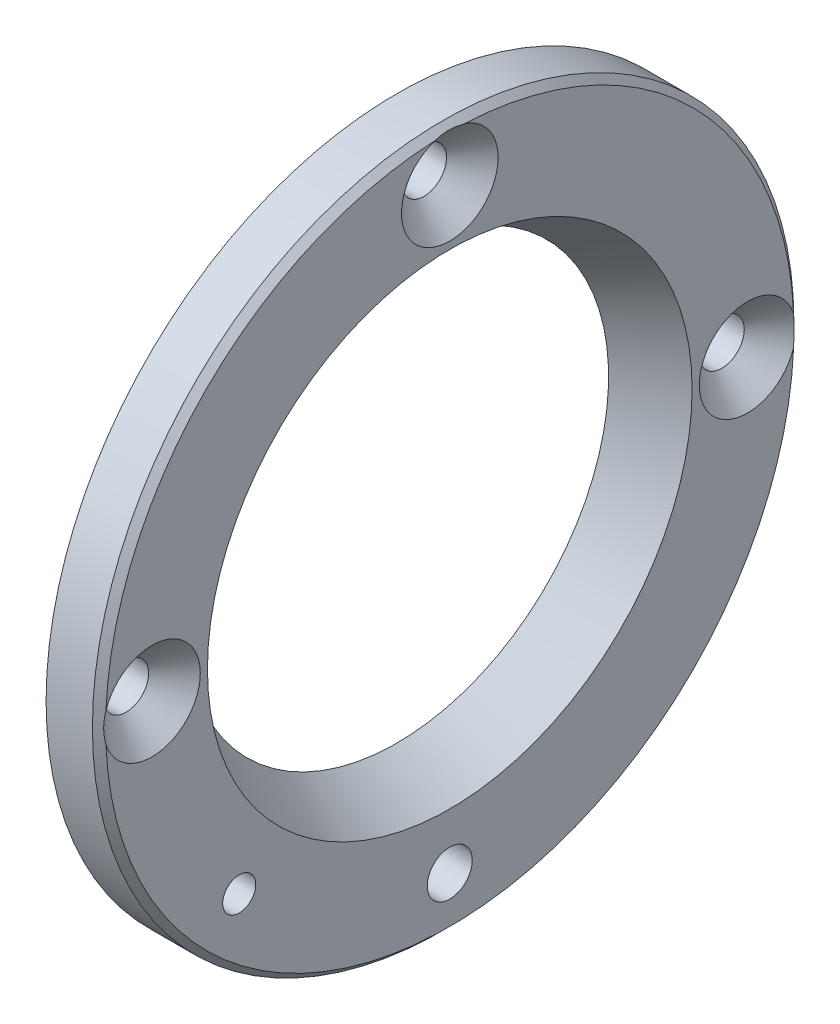
ISO-10303-21;
HEADER;
FILE_DESCRIPTION(('STEP AP214'),'2;1');
FILE_NAME('part.step','',(''),(''),'','','');
FILE_SCHEMA(('AUTOMOTIVE_DESIGN { 1 0 10303 214 1 1 1 1 }'));
ENDSEC;
DATA;
#1=APPLICATION_CONTEXT('core data for automotive mechanical design processes');
#2=APPLICATION_PROTOCOL_DEFINITION('international standard','automotive_design',2000,#1);
#3=PRODUCT_CONTEXT('',#1,'mechanical');
#4=PRODUCT('Part','Part','',(#3));
#5=PRODUCT_RELATED_PRODUCT_CATEGORY('part','',(#4));
#6=PRODUCT_DEFINITION_FORMATION('','',#4);
#7=PRODUCT_DEFINITION_CONTEXT('part definition',#1,'design');
#8=PRODUCT_DEFINITION('design','',#6,#7);
#9=PRODUCT_DEFINITION_SHAPE('','',#8);
#10=(LENGTH_UNIT() NAMED_UNIT(*) SI_UNIT(.MILLI.,.METRE.));
#11=(NAMED_UNIT(*) PLANE_ANGLE_UNIT() SI_UNIT($,.RADIAN.));
#12=(NAMED_UNIT(*) SI_UNIT($,.STERADIAN.) SOLID_ANGLE_UNIT());
#13=UNCERTAINTY_MEASURE_WITH_UNIT(LENGTH_MEASURE(1.E-05),#10,'distance_accuracy_value','');
#14=(GEOMETRIC_REPRESENTATION_CONTEXT(3) GLOBAL_UNCERTAINTY_ASSIGNED_CONTEXT((#13)) GLOBAL_UNIT_ASSIGNED_CONTEXT((#10,
#11,#12)) REPRESENTATION_CONTEXT('',''));
#15=CARTESIAN_POINT('',(0.,0.,0.));
#16=DIRECTION('',(0.,0.,1.));
#17=DIRECTION('',(1.,0.,0.));
#18=AXIS2_PLACEMENT_3D('',#15,#16,#17);
#19=CARTESIAN_POINT('',(4.,26.5,0.));
#20=DIRECTION('',(-1.,0.,0.));
#21=DIRECTION('',(0.,0.,1.));
#22=AXIS2_PLACEMENT_3D('',#19,#20,#21);
#23=PLANE('',#22);
#24=CARTESIAN_POINT('',(4.,0.,0.));
#25=DIRECTION('',(-1.,0.,0.));
#26=DIRECTION('',(0.,0.,1.));
#27=AXIS2_PLACEMENT_3D('',#24,#25,#26);
#28=CIRCLE('',#27,18.3094010767585);
#29=CARTESIAN_POINT('',(4.,0.,18.3094010767585));
#30=VERTEX_POINT('',#29);
#31=EDGE_CURVE('E136',#30,#30,#28,.T.);
#32=ORIENTED_EDGE('',*,*,#31,.T.);
#33=EDGE_LOOP('',(#32));
#34=FACE_BOUND('',#33,.T.);
#35=CARTESIAN_POINT('',(4.,-22.5,0.));
#36=DIRECTION('',(1.,0.,0.));
#37=DIRECTION('',(0.,0.,-1.));
#38=AXIS2_PLACEMENT_3D('',#35,#36,#37);
#39=CIRCLE('',#38,1.7);
#40=CARTESIAN_POINT('',(4.,-22.5,-1.70000000000001));
#41=VERTEX_POINT('',#40);
#42=EDGE_CURVE('E147',#41,#41,#39,.T.);
#43=ORIENTED_EDGE('',*,*,#42,.F.);
#44=EDGE_LOOP('',(#43));
#45=FACE_BOUND('',#44,.T.);
#46=CARTESIAN_POINT('',(4.,0.,22.5));
#47=DIRECTION('',(1.,0.,0.));
#48=DIRECTION('',(0.,0.,-1.));
#49=AXIS2_PLACEMENT_3D('',#46,#47,#48);
#50=CIRCLE('',#49,3.65);
#51=CARTESIAN_POINT('',(4.,-1.11299834032024,25.9761666666667));
#52=VERTEX_POINT('',#51);
#53=CARTESIAN_POINT('',(4.,1.11299834032022,25.9761666666667));
#54=VERTEX_POINT('',#53);
#55=EDGE_CURVE('E160',#52,#54,#50,.T.);
#56=ORIENTED_EDGE('',*,*,#55,.F.);
#57=CARTESIAN_POINT('',(4.,0.,0.));
#58=DIRECTION('',(-1.,0.,0.));
#59=DIRECTION('',(0.,0.,1.));
#60=AXIS2_PLACEMENT_3D('',#57,#58,#59);
#61=CIRCLE('',#60,26.);
#62=CARTESIAN_POINT('',(4.,-1.11299834032023,-25.9761666666667));
#63=VERTEX_POINT('',#62);
#64=EDGE_CURVE('E78',#52,#63,#61,.F.);
#65=ORIENTED_EDGE('',*,*,#64,.T.);
#66=CARTESIAN_POINT('',(4.,0.,-22.5));
#67=DIRECTION('',(1.,0.,0.));
#68=DIRECTION('',(0.,0.,-1.));
#69=AXIS2_PLACEMENT_3D('',#66,#67,#68);
#70=CIRCLE('',#69,3.65);
#71=CARTESIAN_POINT('',(4.,1.11299834032024,-25.9761666666667));
#72=VERTEX_POINT('',#71);
#73=EDGE_CURVE('E74',#72,#63,#70,.T.);
#74=ORIENTED_EDGE('',*,*,#73,.F.);
#75=CARTESIAN_POINT('',(4.,0.,0.));
#76=DIRECTION('',(-1.,0.,0.));
#77=DIRECTION('',(0.,0.,1.));
#78=AXIS2_PLACEMENT_3D('',#75,#76,#77);
#79=CIRCLE('',#78,26.);
#80=CARTESIAN_POINT('',(4.,25.9761666666673,-1.1129983403181));
#81=VERTEX_POINT('',#80);
#82=EDGE_CURVE('E59',#72,#81,#79,.F.);
#83=ORIENTED_EDGE('',*,*,#82,.T.);
#84=CARTESIAN_POINT('',(4.,22.5,0.));
#85=DIRECTION('',(1.,0.,0.));
#86=DIRECTION('',(0.,0.,-1.));
#87=AXIS2_PLACEMENT_3D('',#84,#85,#86);
#88=CIRCLE('',#87,3.65);
#89=CARTESIAN_POINT('',(4.,25.9761666666667,1.11299834032023));
#90=VERTEX_POINT('',#89);
#91=EDGE_CURVE('E169',#90,#81,#88,.T.);
#92=ORIENTED_EDGE('',*,*,#91,.F.);
#93=CARTESIAN_POINT('',(4.,0.,0.));
#94=DIRECTION('',(-1.,0.,0.));
#95=DIRECTION('',(0.,0.,1.));
#96=AXIS2_PLACEMENT_3D('',#93,#94,#95);
#97=CIRCLE('',#96,26.);
#98=EDGE_CURVE('E87',#90,#54,#97,.F.);
#99=ORIENTED_EDGE('',*,*,#98,.T.);
#100=EDGE_LOOP('',(#56,#65,#74,#83,#92,#99));
#101=FACE_BOUND('',#100,.T.);
#102=CARTESIAN_POINT('',(4.,-15.9099025766973,15.9099025766973));
#103=DIRECTION('',(1.,0.,0.));
#104=DIRECTION('',(0.,0.,-1.));
#105=AXIS2_PLACEMENT_3D('',#102,#103,#104);
#106=CIRCLE('',#105,1.24999999999999);
#107=CARTESIAN_POINT('',(4.,-15.9099025766973,14.6599025766974));
#108=VERTEX_POINT('',#107);
#109=EDGE_CURVE('E174',#108,#108,#106,.T.);
#110=ORIENTED_EDGE('',*,*,#109,.F.);
#111=EDGE_LOOP('',(#110));
#112=FACE_BOUND('',#111,.T.);
#113=ADVANCED_FACE('F34',(#34,#45,#101,#112),#23,.F.);
#114=CARTESIAN_POINT('',(0.,16.,0.));
#115=DIRECTION('',(1.,0.,0.));
#116=DIRECTION('',(0.,0.,-1.));
#117=AXIS2_PLACEMENT_3D('',#114,#115,#116);
#118=PLANE('',#117);
#119=CARTESIAN_POINT('',(0.,-15.9099025766973,15.9099025766973));
#120=DIRECTION('',(1.,0.,0.));
#121=DIRECTION('',(0.,0.,-1.));
#122=AXIS2_PLACEMENT_3D('',#119,#120,#121);
#123=CIRCLE('',#122,1.24999999999999);
#124=CARTESIAN_POINT('',(0.,-15.9099025766973,14.6599025766974));
#125=VERTEX_POINT('',#124);
#126=EDGE_CURVE('E171',#125,#125,#123,.T.);
#127=ORIENTED_EDGE('',*,*,#126,.T.);
#128=EDGE_LOOP('',(#127));
#129=FACE_BOUND('',#128,.T.);
#130=CARTESIAN_POINT('',(0.,22.5,0.));
#131=DIRECTION('',(1.,0.,0.));
#132=DIRECTION('',(0.,0.,-1.));
#133=AXIS2_PLACEMENT_3D('',#130,#131,#132);
#134=CIRCLE('',#133,1.7);
#135=CARTESIAN_POINT('',(0.,22.5,-1.70000000000001));
#136=VERTEX_POINT('',#135);
#137=EDGE_CURVE('E163',#136,#136,#134,.T.);
#138=ORIENTED_EDGE('',*,*,#137,.T.);
#139=EDGE_LOOP('',(#138));
#140=FACE_BOUND('',#139,.T.);
#141=CARTESIAN_POINT('',(0.,0.,22.5));
#142=DIRECTION('',(1.,0.,0.));
#143=DIRECTION('',(0.,0.,-1.));
#144=AXIS2_PLACEMENT_3D('',#141,#142,#143);
#145=CIRCLE('',#144,1.7);
#146=CARTESIAN_POINT('',(0.,0.,20.8));
#147=VERTEX_POINT('',#146);
#148=EDGE_CURVE('E83',#147,#147,#145,.T.);
#149=ORIENTED_EDGE('',*,*,#148,.T.);
#150=EDGE_LOOP('',(#149));
#151=FACE_BOUND('',#150,.T.);
#152=CARTESIAN_POINT('',(0.,0.,-22.5));
#153=DIRECTION('',(1.,0.,0.));
#154=DIRECTION('',(0.,0.,-1.));
#155=AXIS2_PLACEMENT_3D('',#152,#153,#154);
#156=CIRCLE('',#155,1.7);
#157=CARTESIAN_POINT('',(0.,0.,-24.2));
#158=VERTEX_POINT('',#157);
#159=EDGE_CURVE('E150',#158,#158,#156,.T.);
#160=ORIENTED_EDGE('',*,*,#159,.T.);
#161=EDGE_LOOP('',(#160));
#162=FACE_BOUND('',#161,.T.);
#163=CARTESIAN_POINT('',(0.,-22.5,0.));
#164=DIRECTION('',(1.,0.,0.));
#165=DIRECTION('',(0.,0.,-1.));
#166=AXIS2_PLACEMENT_3D('',#163,#164,#165);
#167=CIRCLE('',#166,1.7);
#168=CARTESIAN_POINT('',(0.,-22.5,-1.70000000000001));
#169=VERTEX_POINT('',#168);
#170=EDGE_CURVE('E144',#169,#169,#167,.F.);
#171=ORIENTED_EDGE('',*,*,#170,.F.);
#172=EDGE_LOOP('',(#171));
#173=FACE_BOUND('',#172,.T.);
#174=CARTESIAN_POINT('',(0.,0.,0.));
#175=DIRECTION('',(-1.,0.,0.));
#176=DIRECTION('',(0.,0.,1.));
#177=AXIS2_PLACEMENT_3D('',#174,#175,#176);
#178=CIRCLE('',#177,16.);
#179=CARTESIAN_POINT('',(0.,0.,16.));
#180=VERTEX_POINT('',#179);
#181=EDGE_CURVE('E133',#180,#180,#178,.T.);
#182=ORIENTED_EDGE('',*,*,#181,.F.);
#183=EDGE_LOOP('',(#182));
#184=FACE_BOUND('',#183,.T.);
#185=CARTESIAN_POINT('',(0.,0.,0.));
#186=DIRECTION('',(-1.,0.,0.));
#187=DIRECTION('',(0.,0.,1.));
#188=AXIS2_PLACEMENT_3D('',#185,#186,#187);
#189=CIRCLE('',#188,26.5);
#190=CARTESIAN_POINT('',(0.,0.,26.5));
#191=VERTEX_POINT('',#190);
#192=EDGE_CURVE('E139',#191,#191,#189,.T.);
#193=ORIENTED_EDGE('',*,*,#192,.T.);
#194=EDGE_LOOP('',(#193));
#195=FACE_BOUND('',#194,.T.);
#196=ADVANCED_FACE('F118',(#129,#140,#151,#162,#173,#184,#195),#118,.F.);
#197=CARTESIAN_POINT('',(0.,0.,0.));
#198=DIRECTION('',(-1.,0.,0.));
#199=DIRECTION('',(0.,0.,1.));
#200=AXIS2_PLACEMENT_3D('',#197,#198,#199);
#201=CYLINDRICAL_SURFACE('',#200,26.5);
#202=CARTESIAN_POINT('',(3.49999999999999,0.,0.));
#203=DIRECTION('',(-1.,0.,0.));
#204=DIRECTION('',(0.,0.,1.));
#205=AXIS2_PLACEMENT_3D('',#202,#203,#204);
#206=CIRCLE('',#205,26.5);
#207=CARTESIAN_POINT('',(3.49999999999999,0.,26.5));
#208=VERTEX_POINT('',#207);
#209=EDGE_CURVE('E90',#208,#208,#206,.T.);
#210=ORIENTED_EDGE('',*,*,#209,.T.);
#211=EDGE_LOOP('',(#210));
#212=FACE_BOUND('',#211,.T.);
#213=ORIENTED_EDGE('',*,*,#192,.F.);
#214=EDGE_LOOP('',(#213));
#215=FACE_BOUND('',#214,.T.);
#216=ADVANCED_FACE('F120',(#212,#215),#201,.T.);
#217=CARTESIAN_POINT('',(4.,0.,0.));
#218=DIRECTION('',(1.,0.,0.));
#219=DIRECTION('',(0.,0.,-1.));
#220=AXIS2_PLACEMENT_3D('',#217,#218,#219);
#221=CONICAL_SURFACE('',#220,18.3094010767585,0.523598775598297);
#222=ORIENTED_EDGE('',*,*,#181,.T.);
#223=EDGE_LOOP('',(#222));
#224=FACE_BOUND('',#223,.T.);
#225=ORIENTED_EDGE('',*,*,#31,.F.);
#226=EDGE_LOOP('',(#225));
#227=FACE_BOUND('',#226,.T.);
#228=ADVANCED_FACE('F114',(#224,#227),#221,.F.);
#229=CARTESIAN_POINT('',(-0.00100000000000013,-22.5,0.));
#230=DIRECTION('',(1.,0.,0.));
#231=DIRECTION('',(0.,0.,-1.));
#232=AXIS2_PLACEMENT_3D('',#229,#230,#231);
#233=CYLINDRICAL_SURFACE('',#232,1.7);
#234=ORIENTED_EDGE('',*,*,#42,.T.);
#235=EDGE_LOOP('',(#234));
#236=FACE_BOUND('',#235,.T.);
#237=ORIENTED_EDGE('',*,*,#170,.T.);
#238=EDGE_LOOP('',(#237));
#239=FACE_BOUND('',#238,.T.);
#240=ADVANCED_FACE('F110',(#236,#239),#233,.F.);
#241=CARTESIAN_POINT('',(4.,0.,-22.5));
#242=DIRECTION('',(1.,0.,0.));
#243=DIRECTION('',(0.,0.,-1.));
#244=AXIS2_PLACEMENT_3D('',#241,#242,#243);
#245=CYLINDRICAL_SURFACE('',#244,1.7);
#246=ORIENTED_EDGE('',*,*,#159,.F.);
#247=EDGE_LOOP('',(#246));
#248=FACE_BOUND('',#247,.T.);
#249=CARTESIAN_POINT('',(2.05,0.,-22.5));
#250=DIRECTION('',(1.,0.,0.));
#251=DIRECTION('',(0.,0.,-1.));
#252=AXIS2_PLACEMENT_3D('',#249,#250,#251);
#253=CIRCLE('',#252,1.7);
#254=CARTESIAN_POINT('',(2.05,0.,-24.2));
#255=VERTEX_POINT('',#254);
#256=EDGE_CURVE('E82',#255,#255,#253,.T.);
#257=ORIENTED_EDGE('',*,*,#256,.T.);
#258=EDGE_LOOP('',(#257));
#259=FACE_BOUND('',#258,.T.);
#260=ADVANCED_FACE('F106',(#248,#259),#245,.F.);
#261=CARTESIAN_POINT('',(4.,0.,-22.5));
#262=DIRECTION('',(1.,0.,0.));
#263=DIRECTION('',(0.,0.,-1.));
#264=AXIS2_PLACEMENT_3D('',#261,#262,#263);
#265=CONICAL_SURFACE('',#264,3.65,0.785398163397449);
#266=ORIENTED_EDGE('',*,*,#256,.F.);
#267=EDGE_LOOP('',(#266));
#268=FACE_BOUND('',#267,.T.);
#269=ORIENTED_EDGE('',*,*,#73,.T.);
#270=CARTESIAN_POINT('',(4.,-1.11299834032024,-25.9761666666667));
#271=CARTESIAN_POINT('',(3.99044618791025,-1.04235102738784,-25.9887564679145));
#272=CARTESIAN_POINT('',(3.98177277353486,-0.971385420486374,-26.0001861006409));
#273=CARTESIAN_POINT('',(3.96622754394112,-0.828911927422943,-26.0206712587745));
#274=CARTESIAN_POINT('',(3.95935584399486,-0.757404006865234,-26.0297266322788));
#275=CARTESIAN_POINT('',(3.94150291003215,-0.542182250932905,-26.053252831959));
#276=CARTESIAN_POINT('',(3.93328916717092,-0.397809569072077,-26.0640767197677));
#277=CARTESIAN_POINT('',(3.92452622816284,-0.111107729661827,-26.0756243260311));
#278=CARTESIAN_POINT('',(3.92383910239063,0.031210290500293,-26.0765298050814));
#279=CARTESIAN_POINT('',(3.92978493108619,0.315353005913586,-26.0686945241378));
#280=CARTESIAN_POINT('',(3.93641319626048,0.457177958799991,-26.0599599435907));
#281=CARTESIAN_POINT('',(3.95285535329198,0.684487292954245,-26.038292834442));
#282=CARTESIAN_POINT('',(3.96042818697969,0.770434481008799,-26.0283135224956));
#283=CARTESIAN_POINT('',(3.97822959868548,0.94207955939439,-26.0048552177374));
#284=CARTESIAN_POINT('',(3.98847311315326,1.02777321487142,-25.9913565420043));
#285=CARTESIAN_POINT('',(4.,1.11299834032024,-25.9761666666667));
#286=B_SPLINE_CURVE_WITH_KNOTS('',3,(#270,#271,#272,#273,#274,#275,#276,#277,#278,#279,#280,
#281,#282,#283,#284,#285),.UNSPECIFIED.,.F.,.F.,(4,2,2,2,2,2,2,4),(0.,0.217149378445187,
0.434312646526281,0.868759175995013,1.29523060569689,1.72142881845387,1.98189449638606,
2.24384936513155),.UNSPECIFIED.);
#287=EDGE_CURVE('E72',#63,#72,#286,.T.);
#288=ORIENTED_EDGE('',*,*,#287,.T.);
#289=EDGE_LOOP('',(#269,#288));
#290=FACE_BOUND('',#289,.T.);
#291=ADVANCED_FACE('F73',(#268,#290),#265,.F.);
#292=CARTESIAN_POINT('',(4.,0.,22.5));
#293=DIRECTION('',(1.,0.,0.));
#294=DIRECTION('',(0.,0.,-1.));
#295=AXIS2_PLACEMENT_3D('',#292,#293,#294);
#296=CYLINDRICAL_SURFACE('',#295,1.7);
#297=ORIENTED_EDGE('',*,*,#148,.F.);
#298=EDGE_LOOP('',(#297));
#299=FACE_BOUND('',#298,.T.);
#300=CARTESIAN_POINT('',(2.05,0.,22.5));
#301=DIRECTION('',(1.,0.,0.));
#302=DIRECTION('',(0.,0.,-1.));
#303=AXIS2_PLACEMENT_3D('',#300,#301,#302);
#304=CIRCLE('',#303,1.7);
#305=CARTESIAN_POINT('',(2.05,0.,20.8));
#306=VERTEX_POINT('',#305);
#307=EDGE_CURVE('E157',#306,#306,#304,.T.);
#308=ORIENTED_EDGE('',*,*,#307,.T.);
#309=EDGE_LOOP('',(#308));
#310=FACE_BOUND('',#309,.T.);
#311=ADVANCED_FACE('F105',(#299,#310),#296,.F.);
#312=CARTESIAN_POINT('',(4.,0.,22.5));
#313=DIRECTION('',(1.,0.,0.));
#314=DIRECTION('',(0.,0.,-1.));
#315=AXIS2_PLACEMENT_3D('',#312,#313,#314);
#316=CONICAL_SURFACE('',#315,3.65,0.785398163397449);
#317=ORIENTED_EDGE('',*,*,#307,.F.);
#318=EDGE_LOOP('',(#317));
#319=FACE_BOUND('',#318,.T.);
#320=ORIENTED_EDGE('',*,*,#55,.T.);
#321=CARTESIAN_POINT('',(4.,1.11299834032024,25.9761666666667));
#322=CARTESIAN_POINT('',(3.99044618791025,1.04235102738784,25.9887564679145));
#323=CARTESIAN_POINT('',(3.98177277353486,0.971385420486374,26.0001861006409));
#324=CARTESIAN_POINT('',(3.96622754394112,0.828911927422943,26.0206712587745));
#325=CARTESIAN_POINT('',(3.95935584399486,0.757404006865234,26.0297266322788));
#326=CARTESIAN_POINT('',(3.94150291003215,0.542182250932905,26.053252831959));
#327=CARTESIAN_POINT('',(3.93328916717092,0.397809569072077,26.0640767197677));
#328=CARTESIAN_POINT('',(3.92452622816284,0.111107729661827,26.0756243260311));
#329=CARTESIAN_POINT('',(3.92383910239063,-0.031210290500293,26.0765298050814));
#330=CARTESIAN_POINT('',(3.92978493108619,-0.315353005913586,26.0686945241378));
#331=CARTESIAN_POINT('',(3.93641319626048,-0.457177958799991,26.0599599435907));
#332=CARTESIAN_POINT('',(3.95285535329198,-0.684487292954245,26.038292834442));
#333=CARTESIAN_POINT('',(3.96042818697969,-0.770434481008799,26.0283135224956));
#334=CARTESIAN_POINT('',(3.97822959868548,-0.94207955939439,26.0048552177374));
#335=CARTESIAN_POINT('',(3.98847311315326,-1.02777321487142,25.9913565420043));
#336=CARTESIAN_POINT('',(4.,-1.11299834032024,25.9761666666667));
#337=B_SPLINE_CURVE_WITH_KNOTS('',3,(#321,#322,#323,#324,#325,#326,#327,#328,#329,#330,#331,
#332,#333,#334,#335,#336),.UNSPECIFIED.,.F.,.F.,(4,2,2,2,2,2,2,4),(0.,0.217149378445187,
0.434312646526281,0.868759175995013,1.29523060569689,1.72142881845387,1.98189449638606,
2.24384936513155),.UNSPECIFIED.);
#338=EDGE_CURVE('E11',#54,#52,#337,.T.);
#339=ORIENTED_EDGE('',*,*,#338,.T.);
#340=EDGE_LOOP('',(#320,#339));
#341=FACE_BOUND('',#340,.T.);
#342=ADVANCED_FACE('F193',(#319,#341),#316,.F.);
#343=CARTESIAN_POINT('',(4.,22.5,0.));
#344=DIRECTION('',(1.,0.,0.));
#345=DIRECTION('',(0.,0.,-1.));
#346=AXIS2_PLACEMENT_3D('',#343,#344,#345);
#347=CYLINDRICAL_SURFACE('',#346,1.7);
#348=ORIENTED_EDGE('',*,*,#137,.F.);
#349=EDGE_LOOP('',(#348));
#350=FACE_BOUND('',#349,.T.);
#351=CARTESIAN_POINT('',(2.05,22.5,0.));
#352=DIRECTION('',(1.,0.,0.));
#353=DIRECTION('',(0.,0.,-1.));
#354=AXIS2_PLACEMENT_3D('',#351,#352,#353);
#355=CIRCLE('',#354,1.7);
#356=CARTESIAN_POINT('',(2.05,22.5,-1.70000000000001));
#357=VERTEX_POINT('',#356);
#358=EDGE_CURVE('E166',#357,#357,#355,.T.);
#359=ORIENTED_EDGE('',*,*,#358,.T.);
#360=EDGE_LOOP('',(#359));
#361=FACE_BOUND('',#360,.T.);
#362=ADVANCED_FACE('F187',(#350,#361),#347,.F.);
#363=CARTESIAN_POINT('',(4.,22.5,0.));
#364=DIRECTION('',(1.,0.,0.));
#365=DIRECTION('',(0.,0.,-1.));
#366=AXIS2_PLACEMENT_3D('',#363,#364,#365);
#367=CONICAL_SURFACE('',#366,3.65,0.785398163397448);
#368=ORIENTED_EDGE('',*,*,#358,.F.);
#369=EDGE_LOOP('',(#368));
#370=FACE_BOUND('',#369,.T.);
#371=ORIENTED_EDGE('',*,*,#91,.T.);
#372=CARTESIAN_POINT('',(4.,25.9761666666667,-1.11299834032024));
#373=CARTESIAN_POINT('',(3.99044618791026,25.9887564679145,-1.04235102738784));
#374=CARTESIAN_POINT('',(3.98177277353486,26.0001861006409,-0.971385420486381));
#375=CARTESIAN_POINT('',(3.96622754394112,26.0206712587745,-0.828911927422951));
#376=CARTESIAN_POINT('',(3.95935584399486,26.0297266322788,-0.757404006865242));
#377=CARTESIAN_POINT('',(3.94150291003215,26.053252831959,-0.542182250932913));
#378=CARTESIAN_POINT('',(3.93328916717092,26.0640767197677,-0.397809569072085));
#379=CARTESIAN_POINT('',(3.92452622816284,26.0756243260311,-0.111107729661836));
#380=CARTESIAN_POINT('',(3.92383910239063,26.0765298050814,0.0312102905002846));
#381=CARTESIAN_POINT('',(3.92978493108619,26.0686945241378,0.315353005913577));
#382=CARTESIAN_POINT('',(3.93641319626048,26.0599599435907,0.457177958799982));
#383=CARTESIAN_POINT('',(3.95285535329198,26.038292834442,0.684487292954237));
#384=CARTESIAN_POINT('',(3.96042818697969,26.0283135224956,0.770434481008792));
#385=CARTESIAN_POINT('',(3.97822959868548,26.0048552177374,0.942079559394384));
#386=CARTESIAN_POINT('',(3.98847311315326,25.9913565420043,1.02777321487141));
#387=CARTESIAN_POINT('',(4.,25.9761666666667,1.11299834032023));
#388=B_SPLINE_CURVE_WITH_KNOTS('',3,(#372,#373,#374,#375,#376,#377,#378,#379,#380,#381,#382,
#383,#384,#385,#386,#387),.UNSPECIFIED.,.F.,.F.,(4,2,2,2,2,2,2,4),(0.,0.217149378445187,
0.434312646526281,0.868759175995013,1.29523060569688,1.72142881845387,1.98189449638606,
2.24384936513155),.UNSPECIFIED.);
#389=EDGE_CURVE('E47',#81,#90,#388,.T.);
#390=ORIENTED_EDGE('',*,*,#389,.T.);
#391=EDGE_LOOP('',(#371,#390));
#392=FACE_BOUND('',#391,.T.);
#393=ADVANCED_FACE('F180',(#370,#392),#367,.F.);
#394=CARTESIAN_POINT('',(4.,-15.9099025766973,15.9099025766973));
#395=DIRECTION('',(1.,0.,0.));
#396=DIRECTION('',(0.,0.,-1.));
#397=AXIS2_PLACEMENT_3D('',#394,#395,#396);
#398=CYLINDRICAL_SURFACE('',#397,1.24999999999999);
#399=ORIENTED_EDGE('',*,*,#126,.F.);
#400=EDGE_LOOP('',(#399));
#401=FACE_BOUND('',#400,.T.);
#402=ORIENTED_EDGE('',*,*,#109,.T.);
#403=EDGE_LOOP('',(#402));
#404=FACE_BOUND('',#403,.T.);
#405=ADVANCED_FACE('F178',(#401,#404),#398,.F.);
#406=CARTESIAN_POINT('',(3.49999999999999,0.,0.));
#407=DIRECTION('',(-1.,0.,0.));
#408=DIRECTION('',(0.,0.,1.));
#409=AXIS2_PLACEMENT_3D('',#406,#407,#408);
#410=CONICAL_SURFACE('',#409,26.5,0.785398163397444);
#411=ORIENTED_EDGE('',*,*,#287,.F.);
#412=ORIENTED_EDGE('',*,*,#64,.F.);
#413=ORIENTED_EDGE('',*,*,#338,.F.);
#414=ORIENTED_EDGE('',*,*,#98,.F.);
#415=ORIENTED_EDGE('',*,*,#389,.F.);
#416=ORIENTED_EDGE('',*,*,#82,.F.);
#417=EDGE_LOOP('',(#411,#412,#413,#414,#415,#416));
#418=FACE_BOUND('',#417,.T.);
#419=ORIENTED_EDGE('',*,*,#209,.F.);
#420=EDGE_LOOP('',(#419));
#421=FACE_BOUND('',#420,.T.);
#422=ADVANCED_FACE('F36',(#418,#421),#410,.T.);
#423=CLOSED_SHELL('',(#113,#196,#216,#228,#240,#260,#291,#311,#342,#362,#393,#405,#422));
#424=MANIFOLD_SOLID_BREP('B2',#423);
#425=ADVANCED_BREP_SHAPE_REPRESENTATION('',(#18,#424),#14);
#426=SHAPE_DEFINITION_REPRESENTATION(#9,#425);
ENDSEC;
END-ISO-10303-21;
